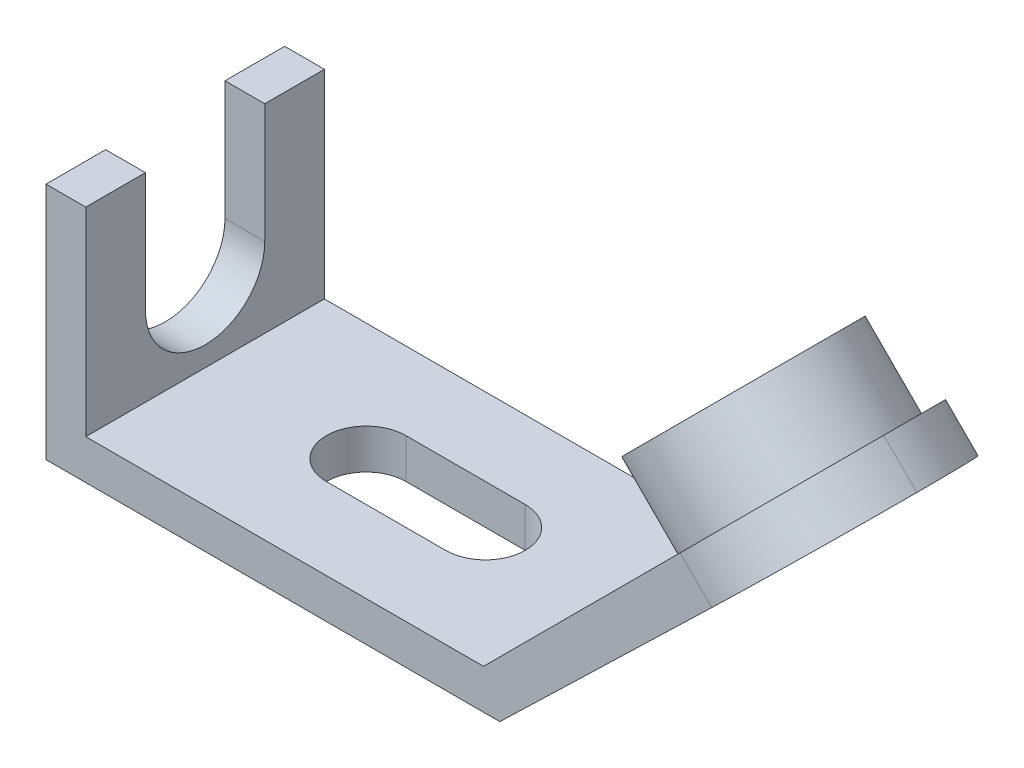
ISO-10303-21;
HEADER;
FILE_DESCRIPTION(('STEP AP214'),'2;1');
FILE_NAME('part.step','',(''),(''),'','','');
FILE_SCHEMA(('AUTOMOTIVE_DESIGN { 1 0 10303 214 1 1 1 1 }'));
ENDSEC;
DATA;
#1=APPLICATION_CONTEXT('core data for automotive mechanical design processes');
#2=APPLICATION_PROTOCOL_DEFINITION('international standard','automotive_design',2000,#1);
#3=PRODUCT_CONTEXT('',#1,'mechanical');
#4=PRODUCT('Part','Part','',(#3));
#5=PRODUCT_RELATED_PRODUCT_CATEGORY('part','',(#4));
#6=PRODUCT_DEFINITION_FORMATION('','',#4);
#7=PRODUCT_DEFINITION_CONTEXT('part definition',#1,'design');
#8=PRODUCT_DEFINITION('design','',#6,#7);
#9=PRODUCT_DEFINITION_SHAPE('','',#8);
#10=(LENGTH_UNIT() NAMED_UNIT(*) SI_UNIT(.MILLI.,.METRE.));
#11=(NAMED_UNIT(*) PLANE_ANGLE_UNIT() SI_UNIT($,.RADIAN.));
#12=(NAMED_UNIT(*) SI_UNIT($,.STERADIAN.) SOLID_ANGLE_UNIT());
#13=UNCERTAINTY_MEASURE_WITH_UNIT(LENGTH_MEASURE(1.E-05),#10,'distance_accuracy_value','');
#14=(GEOMETRIC_REPRESENTATION_CONTEXT(3) GLOBAL_UNCERTAINTY_ASSIGNED_CONTEXT((#13)) GLOBAL_UNIT_ASSIGNED_CONTEXT((#10,
#11,#12)) REPRESENTATION_CONTEXT('',''));
#15=CARTESIAN_POINT('',(0.,0.,0.));
#16=DIRECTION('',(0.,0.,1.));
#17=DIRECTION('',(1.,0.,0.));
#18=AXIS2_PLACEMENT_3D('',#15,#16,#17);
#19=CARTESIAN_POINT('',(0.,60.,60.));
#20=DIRECTION('',(0.,-1.,0.));
#21=DIRECTION('',(0.,0.,-1.));
#22=AXIS2_PLACEMENT_3D('',#19,#20,#21);
#23=PLANE('',#22);
#24=DIRECTION('',(0.,0.,-1.));
#25=VECTOR('',#24,1.);
#26=CARTESIAN_POINT('',(0.,60.,60.));
#27=LINE('',#26,#25);
#28=CARTESIAN_POINT('',(0.,60.,15.));
#29=VERTEX_POINT('',#28);
#30=CARTESIAN_POINT('',(0.,60.,0.));
#31=VERTEX_POINT('',#30);
#32=EDGE_CURVE('E304',#29,#31,#27,.T.);
#33=ORIENTED_EDGE('',*,*,#32,.F.);
#34=DIRECTION('',(1.,0.,0.));
#35=VECTOR('',#34,1.);
#36=CARTESIAN_POINT('',(0.,60.,15.));
#37=LINE('',#36,#35);
#38=CARTESIAN_POINT('',(10.,60.,15.));
#39=VERTEX_POINT('',#38);
#40=EDGE_CURVE('E171',#29,#39,#37,.T.);
#41=ORIENTED_EDGE('',*,*,#40,.T.);
#42=DIRECTION('',(0.,0.,-1.));
#43=VECTOR('',#42,1.);
#44=CARTESIAN_POINT('',(10.,60.,60.));
#45=LINE('',#44,#43);
#46=CARTESIAN_POINT('',(10.,60.,0.));
#47=VERTEX_POINT('',#46);
#48=EDGE_CURVE('E308',#39,#47,#45,.T.);
#49=ORIENTED_EDGE('',*,*,#48,.T.);
#50=DIRECTION('',(-1.,0.,0.));
#51=VECTOR('',#50,1.);
#52=CARTESIAN_POINT('',(0.,60.,0.));
#53=LINE('',#52,#51);
#54=EDGE_CURVE('E295',#47,#31,#53,.T.);
#55=ORIENTED_EDGE('',*,*,#54,.T.);
#56=EDGE_LOOP('',(#33,#41,#49,#55));
#57=FACE_BOUND('',#56,.T.);
#58=ADVANCED_FACE('F38',(#57),#23,.F.);
#59=CARTESIAN_POINT('',(114.1,0.,60.));
#60=DIRECTION('',(0.,1.,0.));
#61=DIRECTION('',(0.,0.,1.));
#62=AXIS2_PLACEMENT_3D('',#59,#60,#61);
#63=PLANE('',#62);
#64=DIRECTION('',(-1.,0.,0.));
#65=VECTOR('',#64,1.);
#66=CARTESIAN_POINT('',(114.1,0.,19.5145805659539));
#67=LINE('',#66,#65);
#68=CARTESIAN_POINT('',(80.,0.,19.5145805659539));
#69=VERTEX_POINT('',#68);
#70=CARTESIAN_POINT('',(50.,0.,19.5145805659539));
#71=VERTEX_POINT('',#70);
#72=EDGE_CURVE('E235',#69,#71,#67,.T.);
#73=ORIENTED_EDGE('',*,*,#72,.T.);
#74=CARTESIAN_POINT('',(50.,0.,29.5145805659539));
#75=DIRECTION('',(0.,1.,0.));
#76=DIRECTION('',(0.,0.,1.));
#77=AXIS2_PLACEMENT_3D('',#74,#75,#76);
#78=CIRCLE('',#77,10.);
#79=CARTESIAN_POINT('',(50.,0.,39.5145805659539));
#80=VERTEX_POINT('',#79);
#81=EDGE_CURVE('E239',#71,#80,#78,.T.);
#82=ORIENTED_EDGE('',*,*,#81,.T.);
#83=DIRECTION('',(1.,0.,0.));
#84=VECTOR('',#83,1.);
#85=CARTESIAN_POINT('',(114.1,0.,39.5145805659539));
#86=LINE('',#85,#84);
#87=CARTESIAN_POINT('',(80.,0.,39.5145805659539));
#88=VERTEX_POINT('',#87);
#89=EDGE_CURVE('E219',#80,#88,#86,.T.);
#90=ORIENTED_EDGE('',*,*,#89,.T.);
#91=CARTESIAN_POINT('',(80.,0.,29.5145805659539));
#92=DIRECTION('',(0.,1.,0.));
#93=DIRECTION('',(0.,0.,1.));
#94=AXIS2_PLACEMENT_3D('',#91,#92,#93);
#95=CIRCLE('',#94,10.);
#96=EDGE_CURVE('E231',#88,#69,#95,.T.);
#97=ORIENTED_EDGE('',*,*,#96,.T.);
#98=EDGE_LOOP('',(#73,#82,#90,#97));
#99=FACE_BOUND('',#98,.T.);
#100=DIRECTION('',(1.,0.,0.));
#101=VECTOR('',#100,1.);
#102=CARTESIAN_POINT('',(114.1,0.,0.));
#103=LINE('',#102,#101);
#104=CARTESIAN_POINT('',(0.,0.,0.));
#105=VERTEX_POINT('',#104);
#106=CARTESIAN_POINT('',(114.1,0.,0.));
#107=VERTEX_POINT('',#106);
#108=EDGE_CURVE('E252',#105,#107,#103,.T.);
#109=ORIENTED_EDGE('',*,*,#108,.T.);
#110=DIRECTION('',(0.,0.,-1.));
#111=VECTOR('',#110,1.);
#112=CARTESIAN_POINT('',(114.1,0.,60.));
#113=LINE('',#112,#111);
#114=CARTESIAN_POINT('',(114.1,0.,60.));
#115=VERTEX_POINT('',#114);
#116=EDGE_CURVE('E321',#115,#107,#113,.T.);
#117=ORIENTED_EDGE('',*,*,#116,.F.);
#118=DIRECTION('',(1.,0.,0.));
#119=VECTOR('',#118,1.);
#120=CARTESIAN_POINT('',(114.1,0.,60.));
#121=LINE('',#120,#119);
#122=CARTESIAN_POINT('',(0.,0.,60.));
#123=VERTEX_POINT('',#122);
#124=EDGE_CURVE('E253',#123,#115,#121,.T.);
#125=ORIENTED_EDGE('',*,*,#124,.F.);
#126=DIRECTION('',(0.,0.,-1.));
#127=VECTOR('',#126,1.);
#128=CARTESIAN_POINT('',(0.,0.,60.));
#129=LINE('',#128,#127);
#130=EDGE_CURVE('E277',#123,#105,#129,.T.);
#131=ORIENTED_EDGE('',*,*,#130,.T.);
#132=EDGE_LOOP('',(#109,#117,#125,#131));
#133=FACE_BOUND('',#132,.T.);
#134=ADVANCED_FACE('F388',(#99,#133),#63,.F.);
#135=CARTESIAN_POINT('',(188.962882851594,72.3350452488178,60.));
#136=DIRECTION('',(-0.694861145521785,0.719143927488895,0.));
#137=DIRECTION('',(-0.719143927488895,-0.694861145521785,0.));
#138=AXIS2_PLACEMENT_3D('',#135,#136,#137);
#139=PLANE('',#138);
#140=CARTESIAN_POINT('',(167.448157867838,51.5467914982784,30.));
#141=DIRECTION('',(-0.694861145521785,0.719143927488895,0.));
#142=DIRECTION('',(-0.719143927488895,-0.694861145521785,0.));
#143=AXIS2_PLACEMENT_3D('',#140,#141,#142);
#144=ELLIPSE('',#143,15.0022116896862,15.);
#145=CARTESIAN_POINT('',(156.659408432298,41.1223374982228,30.));
#146=VERTEX_POINT('',#145);
#147=EDGE_CURVE('E42',#146,#146,#144,.T.);
#148=ORIENTED_EDGE('',*,*,#147,.T.);
#149=EDGE_LOOP('',(#148));
#150=FACE_BOUND('',#149,.T.);
#151=CARTESIAN_POINT('',(167.385383980512,51.4861372487065,30.));
#152=DIRECTION('',(-0.694861145521785,0.719143927488895,0.));
#153=DIRECTION('',(0.719143927488895,0.694861145521785,0.));
#154=AXIS2_PLACEMENT_3D('',#151,#152,#153);
#155=ELLIPSE('',#154,30.0044233793724,30.);
#156=CARTESIAN_POINT('',(167.385383980512,51.4861372487065,0.));
#157=VERTEX_POINT('',#156);
#158=CARTESIAN_POINT('',(188.962882851594,72.3350452488178,30.));
#159=VERTEX_POINT('',#158);
#160=EDGE_CURVE('E339',#157,#159,#155,.F.);
#161=ORIENTED_EDGE('',*,*,#160,.T.);
#162=CARTESIAN_POINT('',(167.385383980512,51.4861372487065,30.));
#163=DIRECTION('',(-0.694861145521785,0.719143927488895,0.));
#164=DIRECTION('',(-0.719143927488895,-0.694861145521785,0.));
#165=AXIS2_PLACEMENT_3D('',#162,#163,#164);
#166=ELLIPSE('',#165,30.0044233793724,30.);
#167=CARTESIAN_POINT('',(167.385383980512,51.4861372487065,60.));
#168=VERTEX_POINT('',#167);
#169=EDGE_CURVE('E342',#159,#168,#166,.F.);
#170=ORIENTED_EDGE('',*,*,#169,.T.);
#171=DIRECTION('',(0.719143927488895,0.694861145521785,0.));
#172=VECTOR('',#171,1.);
#173=CARTESIAN_POINT('',(188.962882851594,72.3350452488178,60.));
#174=LINE('',#173,#172);
#175=EDGE_CURVE('E257',#115,#168,#174,.T.);
#176=ORIENTED_EDGE('',*,*,#175,.F.);
#177=ORIENTED_EDGE('',*,*,#116,.T.);
#178=DIRECTION('',(0.719143927488895,0.694861145521785,0.));
#179=VECTOR('',#178,1.);
#180=CARTESIAN_POINT('',(188.962882851594,72.3350452488178,0.));
#181=LINE('',#180,#179);
#182=EDGE_CURVE('E281',#107,#157,#181,.T.);
#183=ORIENTED_EDGE('',*,*,#182,.T.);
#184=EDGE_LOOP('',(#161,#170,#176,#177,#183));
#185=FACE_BOUND('',#184,.T.);
#186=ADVANCED_FACE('F384',(#150,#185),#139,.F.);
#187=CARTESIAN_POINT('',(110.,9.99999999999999,60.));
#188=DIRECTION('',(0.707106781186548,-0.707106781186547,0.));
#189=DIRECTION('',(0.707106781186547,0.707106781186548,0.));
#190=AXIS2_PLACEMENT_3D('',#187,#188,#189);
#191=PLANE('',#190);
#192=CARTESIAN_POINT('',(159.497474683058,59.4974746830583,30.));
#193=DIRECTION('',(0.707106781186548,-0.707106781186547,0.));
#194=DIRECTION('',(0.707106781186547,0.707106781186548,0.));
#195=AXIS2_PLACEMENT_3D('',#192,#193,#194);
#196=CIRCLE('',#195,25.);
#197=CARTESIAN_POINT('',(177.175144212722,77.175144212722,30.));
#198=VERTEX_POINT('',#197);
#199=EDGE_CURVE('E325',#198,#198,#196,.F.);
#200=ORIENTED_EDGE('',*,*,#199,.F.);
#201=EDGE_LOOP('',(#200));
#202=FACE_BOUND('',#201,.T.);
#203=DIRECTION('',(-0.707106781186547,-0.707106781186548,0.));
#204=VECTOR('',#203,1.);
#205=CARTESIAN_POINT('',(110.,9.99999999999999,60.));
#206=LINE('',#205,#204);
#207=CARTESIAN_POINT('',(159.435760614609,59.4357606146094,60.));
#208=VERTEX_POINT('',#207);
#209=CARTESIAN_POINT('',(110.,9.99999999999999,60.));
#210=VERTEX_POINT('',#209);
#211=EDGE_CURVE('E262',#208,#210,#206,.T.);
#212=ORIENTED_EDGE('',*,*,#211,.F.);
#213=CARTESIAN_POINT('',(159.435760614609,59.4357606146094,30.));
#214=DIRECTION('',(0.707106781186548,-0.707106781186547,0.));
#215=DIRECTION('',(0.707106781186547,0.707106781186548,0.));
#216=AXIS2_PLACEMENT_3D('',#213,#214,#215);
#217=CIRCLE('',#216,30.);
#218=CARTESIAN_POINT('',(180.648964050206,80.6489640502059,30.));
#219=VERTEX_POINT('',#218);
#220=EDGE_CURVE('E336',#208,#219,#217,.F.);
#221=ORIENTED_EDGE('',*,*,#220,.T.);
#222=CARTESIAN_POINT('',(159.435760614609,59.4357606146094,30.));
#223=DIRECTION('',(0.707106781186548,-0.707106781186547,0.));
#224=DIRECTION('',(0.707106781186547,0.707106781186548,0.));
#225=AXIS2_PLACEMENT_3D('',#222,#223,#224);
#226=CIRCLE('',#225,30.);
#227=CARTESIAN_POINT('',(159.435760614609,59.4357606146094,0.));
#228=VERTEX_POINT('',#227);
#229=EDGE_CURVE('E333',#219,#228,#226,.F.);
#230=ORIENTED_EDGE('',*,*,#229,.T.);
#231=DIRECTION('',(-0.707106781186547,-0.707106781186548,0.));
#232=VECTOR('',#231,1.);
#233=CARTESIAN_POINT('',(110.,9.99999999999999,0.));
#234=LINE('',#233,#232);
#235=CARTESIAN_POINT('',(110.,9.99999999999999,0.));
#236=VERTEX_POINT('',#235);
#237=EDGE_CURVE('E285',#228,#236,#234,.T.);
#238=ORIENTED_EDGE('',*,*,#237,.T.);
#239=DIRECTION('',(0.,0.,-1.));
#240=VECTOR('',#239,1.);
#241=CARTESIAN_POINT('',(110.,9.99999999999999,60.));
#242=LINE('',#241,#240);
#243=EDGE_CURVE('E317',#210,#236,#242,.T.);
#244=ORIENTED_EDGE('',*,*,#243,.F.);
#245=EDGE_LOOP('',(#212,#221,#230,#238,#244));
#246=FACE_BOUND('',#245,.T.);
#247=ADVANCED_FACE('F361',(#202,#246),#191,.F.);
#248=CARTESIAN_POINT('',(10.,9.99999999999999,60.));
#249=DIRECTION('',(0.,-1.,0.));
#250=DIRECTION('',(0.,0.,-1.));
#251=AXIS2_PLACEMENT_3D('',#248,#249,#250);
#252=PLANE('',#251);
#253=DIRECTION('',(1.,0.,0.));
#254=VECTOR('',#253,1.);
#255=CARTESIAN_POINT('',(50.,9.99999999999999,39.5145805659539));
#256=LINE('',#255,#254);
#257=CARTESIAN_POINT('',(50.,9.99999999999999,39.5145805659539));
#258=VERTEX_POINT('',#257);
#259=CARTESIAN_POINT('',(80.,9.99999999999999,39.5145805659539));
#260=VERTEX_POINT('',#259);
#261=EDGE_CURVE('E204',#258,#260,#256,.T.);
#262=ORIENTED_EDGE('',*,*,#261,.F.);
#263=CARTESIAN_POINT('',(50.,9.99999999999999,29.5145805659539));
#264=DIRECTION('',(0.,1.,0.));
#265=DIRECTION('',(0.,0.,1.));
#266=AXIS2_PLACEMENT_3D('',#263,#264,#265);
#267=CIRCLE('',#266,10.);
#268=CARTESIAN_POINT('',(50.,9.99999999999999,19.5145805659539));
#269=VERTEX_POINT('',#268);
#270=EDGE_CURVE('E201',#269,#258,#267,.T.);
#271=ORIENTED_EDGE('',*,*,#270,.F.);
#272=DIRECTION('',(-1.,0.,0.));
#273=VECTOR('',#272,1.);
#274=CARTESIAN_POINT('',(50.,9.99999999999999,19.5145805659539));
#275=LINE('',#274,#273);
#276=CARTESIAN_POINT('',(80.,9.99999999999999,19.5145805659539));
#277=VERTEX_POINT('',#276);
#278=EDGE_CURVE('E211',#277,#269,#275,.T.);
#279=ORIENTED_EDGE('',*,*,#278,.F.);
#280=CARTESIAN_POINT('',(80.,9.99999999999999,29.5145805659539));
#281=DIRECTION('',(0.,1.,0.));
#282=DIRECTION('',(0.,0.,1.));
#283=AXIS2_PLACEMENT_3D('',#280,#281,#282);
#284=CIRCLE('',#283,10.);
#285=EDGE_CURVE('E207',#260,#277,#284,.T.);
#286=ORIENTED_EDGE('',*,*,#285,.F.);
#287=EDGE_LOOP('',(#262,#271,#279,#286));
#288=FACE_BOUND('',#287,.T.);
#289=DIRECTION('',(-1.,0.,0.));
#290=VECTOR('',#289,1.);
#291=CARTESIAN_POINT('',(10.,9.99999999999999,0.));
#292=LINE('',#291,#290);
#293=CARTESIAN_POINT('',(10.,9.99999999999999,0.));
#294=VERTEX_POINT('',#293);
#295=EDGE_CURVE('E288',#236,#294,#292,.T.);
#296=ORIENTED_EDGE('',*,*,#295,.T.);
#297=DIRECTION('',(0.,0.,-1.));
#298=VECTOR('',#297,1.);
#299=CARTESIAN_POINT('',(10.,9.99999999999999,60.));
#300=LINE('',#299,#298);
#301=CARTESIAN_POINT('',(10.,9.99999999999999,60.));
#302=VERTEX_POINT('',#301);
#303=EDGE_CURVE('E313',#302,#294,#300,.T.);
#304=ORIENTED_EDGE('',*,*,#303,.F.);
#305=DIRECTION('',(-1.,0.,0.));
#306=VECTOR('',#305,1.);
#307=CARTESIAN_POINT('',(10.,9.99999999999999,60.));
#308=LINE('',#307,#306);
#309=EDGE_CURVE('E265',#210,#302,#308,.T.);
#310=ORIENTED_EDGE('',*,*,#309,.F.);
#311=ORIENTED_EDGE('',*,*,#243,.T.);
#312=EDGE_LOOP('',(#296,#304,#310,#311));
#313=FACE_BOUND('',#312,.T.);
#314=ADVANCED_FACE('F370',(#288,#313),#252,.F.);
#315=CARTESIAN_POINT('',(10.,60.,60.));
#316=DIRECTION('',(-1.,0.,0.));
#317=DIRECTION('',(0.,-1.,0.));
#318=AXIS2_PLACEMENT_3D('',#315,#316,#317);
#319=PLANE('',#318);
#320=ORIENTED_EDGE('',*,*,#48,.F.);
#321=DIRECTION('',(0.,-1.,0.));
#322=VECTOR('',#321,1.);
#323=CARTESIAN_POINT('',(10.,60.,15.));
#324=LINE('',#323,#322);
#325=CARTESIAN_POINT('',(10.,30.,15.));
#326=VERTEX_POINT('',#325);
#327=EDGE_CURVE('E196',#39,#326,#324,.T.);
#328=ORIENTED_EDGE('',*,*,#327,.T.);
#329=CARTESIAN_POINT('',(10.,30.,30.));
#330=DIRECTION('',(-1.,0.,0.));
#331=DIRECTION('',(0.,-1.,0.));
#332=AXIS2_PLACEMENT_3D('',#329,#330,#331);
#333=CIRCLE('',#332,15.);
#334=CARTESIAN_POINT('',(10.,30.,45.));
#335=VERTEX_POINT('',#334);
#336=EDGE_CURVE('E162',#326,#335,#333,.T.);
#337=ORIENTED_EDGE('',*,*,#336,.T.);
#338=DIRECTION('',(0.,1.,0.));
#339=VECTOR('',#338,1.);
#340=CARTESIAN_POINT('',(10.,60.,45.));
#341=LINE('',#340,#339);
#342=CARTESIAN_POINT('',(10.,60.,45.));
#343=VERTEX_POINT('',#342);
#344=EDGE_CURVE('E190',#335,#343,#341,.T.);
#345=ORIENTED_EDGE('',*,*,#344,.T.);
#346=CARTESIAN_POINT('',(10.,60.,60.));
#347=VERTEX_POINT('',#346);
#348=EDGE_CURVE('E309',#347,#343,#45,.T.);
#349=ORIENTED_EDGE('',*,*,#348,.F.);
#350=DIRECTION('',(0.,1.,0.));
#351=VECTOR('',#350,1.);
#352=CARTESIAN_POINT('',(10.,60.,60.));
#353=LINE('',#352,#351);
#354=EDGE_CURVE('E268',#302,#347,#353,.T.);
#355=ORIENTED_EDGE('',*,*,#354,.F.);
#356=ORIENTED_EDGE('',*,*,#303,.T.);
#357=DIRECTION('',(0.,1.,0.));
#358=VECTOR('',#357,1.);
#359=CARTESIAN_POINT('',(10.,60.,0.));
#360=LINE('',#359,#358);
#361=EDGE_CURVE('E291',#294,#47,#360,.T.);
#362=ORIENTED_EDGE('',*,*,#361,.T.);
#363=EDGE_LOOP('',(#320,#328,#337,#345,#349,#355,#356,#362));
#364=FACE_BOUND('',#363,.T.);
#365=ADVANCED_FACE('F375',(#364),#319,.F.);
#366=ORIENTED_EDGE('',*,*,#348,.T.);
#367=DIRECTION('',(-1.,0.,0.));
#368=VECTOR('',#367,1.);
#369=CARTESIAN_POINT('',(0.,60.,45.));
#370=LINE('',#369,#368);
#371=CARTESIAN_POINT('',(0.,60.,45.));
#372=VERTEX_POINT('',#371);
#373=EDGE_CURVE('E166',#343,#372,#370,.T.);
#374=ORIENTED_EDGE('',*,*,#373,.T.);
#375=CARTESIAN_POINT('',(0.,60.,60.));
#376=VERTEX_POINT('',#375);
#377=EDGE_CURVE('E305',#376,#372,#27,.T.);
#378=ORIENTED_EDGE('',*,*,#377,.F.);
#379=DIRECTION('',(-1.,0.,0.));
#380=VECTOR('',#379,1.);
#381=CARTESIAN_POINT('',(0.,60.,60.));
#382=LINE('',#381,#380);
#383=EDGE_CURVE('E271',#347,#376,#382,.T.);
#384=ORIENTED_EDGE('',*,*,#383,.F.);
#385=EDGE_LOOP('',(#366,#374,#378,#384));
#386=FACE_BOUND('',#385,.T.);
#387=ADVANCED_FACE('F396',(#386),#23,.F.);
#388=CARTESIAN_POINT('',(0.,0.,60.));
#389=DIRECTION('',(1.,0.,0.));
#390=DIRECTION('',(0.,0.,-1.));
#391=AXIS2_PLACEMENT_3D('',#388,#389,#390);
#392=PLANE('',#391);
#393=CARTESIAN_POINT('',(0.,30.,30.));
#394=DIRECTION('',(-1.,0.,0.));
#395=DIRECTION('',(0.,0.,1.));
#396=AXIS2_PLACEMENT_3D('',#393,#394,#395);
#397=CIRCLE('',#396,15.);
#398=CARTESIAN_POINT('',(0.,30.,15.));
#399=VERTEX_POINT('',#398);
#400=CARTESIAN_POINT('',(0.,30.,45.));
#401=VERTEX_POINT('',#400);
#402=EDGE_CURVE('E55',#399,#401,#397,.T.);
#403=ORIENTED_EDGE('',*,*,#402,.F.);
#404=DIRECTION('',(0.,1.,0.));
#405=VECTOR('',#404,1.);
#406=CARTESIAN_POINT('',(0.,0.,15.));
#407=LINE('',#406,#405);
#408=EDGE_CURVE('E11',#399,#29,#407,.T.);
#409=ORIENTED_EDGE('',*,*,#408,.T.);
#410=ORIENTED_EDGE('',*,*,#32,.T.);
#411=DIRECTION('',(0.,-1.,0.));
#412=VECTOR('',#411,1.);
#413=CARTESIAN_POINT('',(0.,0.,0.));
#414=LINE('',#413,#412);
#415=EDGE_CURVE('E258',#31,#105,#414,.T.);
#416=ORIENTED_EDGE('',*,*,#415,.T.);
#417=ORIENTED_EDGE('',*,*,#130,.F.);
#418=DIRECTION('',(0.,-1.,0.));
#419=VECTOR('',#418,1.);
#420=CARTESIAN_POINT('',(0.,0.,60.));
#421=LINE('',#420,#419);
#422=EDGE_CURVE('E274',#376,#123,#421,.T.);
#423=ORIENTED_EDGE('',*,*,#422,.F.);
#424=ORIENTED_EDGE('',*,*,#377,.T.);
#425=DIRECTION('',(0.,1.,0.));
#426=VECTOR('',#425,1.);
#427=CARTESIAN_POINT('',(0.,30.,45.));
#428=LINE('',#427,#426);
#429=EDGE_CURVE('E177',#401,#372,#428,.T.);
#430=ORIENTED_EDGE('',*,*,#429,.F.);
#431=EDGE_LOOP('',(#403,#409,#410,#416,#417,#423,#424,#430));
#432=FACE_BOUND('',#431,.T.);
#433=ADVANCED_FACE('F175',(#432),#392,.F.);
#434=CARTESIAN_POINT('',(0.,0.,60.));
#435=DIRECTION('',(0.,0.,-1.));
#436=DIRECTION('',(-1.,0.,0.));
#437=AXIS2_PLACEMENT_3D('',#434,#435,#436);
#438=PLANE('',#437);
#439=ORIENTED_EDGE('',*,*,#175,.T.);
#440=DIRECTION('',(-0.707106781186549,0.707106781186546,0.));
#441=VECTOR('',#440,1.);
#442=CARTESIAN_POINT('',(109.435760614609,109.43576061461,60.));
#443=LINE('',#442,#441);
#444=EDGE_CURVE('E329',#168,#208,#443,.T.);
#445=ORIENTED_EDGE('',*,*,#444,.T.);
#446=ORIENTED_EDGE('',*,*,#211,.T.);
#447=ORIENTED_EDGE('',*,*,#309,.T.);
#448=ORIENTED_EDGE('',*,*,#354,.T.);
#449=ORIENTED_EDGE('',*,*,#383,.T.);
#450=ORIENTED_EDGE('',*,*,#422,.T.);
#451=ORIENTED_EDGE('',*,*,#124,.T.);
#452=EDGE_LOOP('',(#439,#445,#446,#447,#448,#449,#450,#451));
#453=FACE_BOUND('',#452,.T.);
#454=ADVANCED_FACE('F379',(#453),#438,.F.);
#455=CARTESIAN_POINT('',(0.,0.,0.));
#456=DIRECTION('',(0.,0.,-1.));
#457=DIRECTION('',(-1.,0.,0.));
#458=AXIS2_PLACEMENT_3D('',#455,#456,#457);
#459=PLANE('',#458);
#460=ORIENTED_EDGE('',*,*,#237,.F.);
#461=DIRECTION('',(-0.707106781186549,0.707106781186546,0.));
#462=VECTOR('',#461,1.);
#463=CARTESIAN_POINT('',(167.749679415998,51.1218418132214,0.));
#464=LINE('',#463,#462);
#465=EDGE_CURVE('E48',#228,#157,#464,.F.);
#466=ORIENTED_EDGE('',*,*,#465,.T.);
#467=ORIENTED_EDGE('',*,*,#182,.F.);
#468=ORIENTED_EDGE('',*,*,#108,.F.);
#469=ORIENTED_EDGE('',*,*,#415,.F.);
#470=ORIENTED_EDGE('',*,*,#54,.F.);
#471=ORIENTED_EDGE('',*,*,#361,.F.);
#472=ORIENTED_EDGE('',*,*,#295,.F.);
#473=EDGE_LOOP('',(#460,#466,#467,#468,#469,#470,#471,#472));
#474=FACE_BOUND('',#473,.T.);
#475=ADVANCED_FACE('F365',(#474),#459,.T.);
#476=CARTESIAN_POINT('',(145.355339059327,73.6396103067893,30.));
#477=DIRECTION('',(-0.707106781186548,0.707106781186547,0.));
#478=DIRECTION('',(-0.707106781186547,-0.707106781186548,0.));
#479=AXIS2_PLACEMENT_3D('',#476,#477,#478);
#480=PLANE('',#479);
#481=CARTESIAN_POINT('',(145.355339059327,73.6396103067893,30.));
#482=DIRECTION('',(-0.707106781186548,0.707106781186547,0.));
#483=DIRECTION('',(-0.707106781186547,-0.707106781186548,0.));
#484=AXIS2_PLACEMENT_3D('',#481,#482,#483);
#485=CIRCLE('',#484,25.);
#486=CARTESIAN_POINT('',(127.677669529664,55.9619407771256,30.));
#487=VERTEX_POINT('',#486);
#488=EDGE_CURVE('E248',#487,#487,#485,.T.);
#489=ORIENTED_EDGE('',*,*,#488,.T.);
#490=EDGE_LOOP('',(#489));
#491=FACE_BOUND('',#490,.T.);
#492=CARTESIAN_POINT('',(145.355339059327,73.6396103067893,30.));
#493=DIRECTION('',(-0.707106781186548,0.707106781186547,0.));
#494=DIRECTION('',(-0.707106781186547,-0.707106781186548,0.));
#495=AXIS2_PLACEMENT_3D('',#492,#493,#494);
#496=CIRCLE('',#495,15.);
#497=CARTESIAN_POINT('',(134.748737341529,63.0330085889911,30.));
#498=VERTEX_POINT('',#497);
#499=EDGE_CURVE('E244',#498,#498,#496,.T.);
#500=ORIENTED_EDGE('',*,*,#499,.F.);
#501=EDGE_LOOP('',(#500));
#502=FACE_BOUND('',#501,.T.);
#503=ADVANCED_FACE('F449',(#491,#502),#480,.T.);
#504=CARTESIAN_POINT('',(145.355339059327,73.6396103067893,30.));
#505=DIRECTION('',(0.707106781186548,-0.707106781186547,0.));
#506=DIRECTION('',(0.707106781186547,0.707106781186548,0.));
#507=AXIS2_PLACEMENT_3D('',#504,#505,#506);
#508=CYLINDRICAL_SURFACE('',#507,25.);
#509=ORIENTED_EDGE('',*,*,#488,.F.);
#510=EDGE_LOOP('',(#509));
#511=FACE_BOUND('',#510,.T.);
#512=ORIENTED_EDGE('',*,*,#199,.T.);
#513=EDGE_LOOP('',(#512));
#514=FACE_BOUND('',#513,.T.);
#515=ADVANCED_FACE('F443',(#511,#514),#508,.T.);
#516=CARTESIAN_POINT('',(145.355339059327,73.6396103067893,30.));
#517=DIRECTION('',(0.707106781186548,-0.707106781186547,0.));
#518=DIRECTION('',(0.707106781186547,0.707106781186548,0.));
#519=AXIS2_PLACEMENT_3D('',#516,#517,#518);
#520=CYLINDRICAL_SURFACE('',#519,15.);
#521=ORIENTED_EDGE('',*,*,#499,.T.);
#522=EDGE_LOOP('',(#521));
#523=FACE_BOUND('',#522,.T.);
#524=ORIENTED_EDGE('',*,*,#147,.F.);
#525=EDGE_LOOP('',(#524));
#526=FACE_BOUND('',#525,.T.);
#527=ADVANCED_FACE('F439',(#523,#526),#520,.F.);
#528=CARTESIAN_POINT('',(159.435760614609,59.4357606146094,30.));
#529=DIRECTION('',(0.707106781186549,-0.707106781186546,0.));
#530=DIRECTION('',(0.707106781186546,0.707106781186549,0.));
#531=AXIS2_PLACEMENT_3D('',#528,#529,#530);
#532=CYLINDRICAL_SURFACE('',#531,30.);
#533=DIRECTION('',(-0.707106781186549,0.707106781186546,0.));
#534=VECTOR('',#533,1.);
#535=CARTESIAN_POINT('',(180.648964050206,80.6489640502059,30.));
#536=LINE('',#535,#534);
#537=EDGE_CURVE('E243',#159,#219,#536,.T.);
#538=ORIENTED_EDGE('',*,*,#537,.F.);
#539=ORIENTED_EDGE('',*,*,#160,.F.);
#540=ORIENTED_EDGE('',*,*,#465,.F.);
#541=ORIENTED_EDGE('',*,*,#229,.F.);
#542=EDGE_LOOP('',(#538,#539,#540,#541));
#543=FACE_BOUND('',#542,.T.);
#544=ADVANCED_FACE('F40',(#543),#532,.T.);
#545=CARTESIAN_POINT('',(109.435760614609,109.43576061461,30.));
#546=DIRECTION('',(-0.707106781186549,0.707106781186546,0.));
#547=DIRECTION('',(-0.707106781186546,-0.707106781186549,0.));
#548=AXIS2_PLACEMENT_3D('',#545,#546,#547);
#549=CYLINDRICAL_SURFACE('',#548,30.);
#550=ORIENTED_EDGE('',*,*,#169,.F.);
#551=ORIENTED_EDGE('',*,*,#537,.T.);
#552=ORIENTED_EDGE('',*,*,#220,.F.);
#553=ORIENTED_EDGE('',*,*,#444,.F.);
#554=EDGE_LOOP('',(#550,#551,#552,#553));
#555=FACE_BOUND('',#554,.T.);
#556=ADVANCED_FACE('F352',(#555),#549,.T.);
#557=CARTESIAN_POINT('',(50.,-10.,29.5145805659539));
#558=DIRECTION('',(0.,1.,0.));
#559=DIRECTION('',(0.,0.,1.));
#560=AXIS2_PLACEMENT_3D('',#557,#558,#559);
#561=CYLINDRICAL_SURFACE('',#560,10.);
#562=DIRECTION('',(0.,1.,0.));
#563=VECTOR('',#562,1.);
#564=CARTESIAN_POINT('',(50.,-10.,19.5145805659539));
#565=LINE('',#564,#563);
#566=EDGE_CURVE('E216',#71,#269,#565,.T.);
#567=ORIENTED_EDGE('',*,*,#566,.T.);
#568=ORIENTED_EDGE('',*,*,#270,.T.);
#569=DIRECTION('',(0.,1.,0.));
#570=VECTOR('',#569,1.);
#571=CARTESIAN_POINT('',(50.,-10.,39.5145805659539));
#572=LINE('',#571,#570);
#573=EDGE_CURVE('E215',#80,#258,#572,.T.);
#574=ORIENTED_EDGE('',*,*,#573,.F.);
#575=ORIENTED_EDGE('',*,*,#81,.F.);
#576=EDGE_LOOP('',(#567,#568,#574,#575));
#577=FACE_BOUND('',#576,.T.);
#578=ADVANCED_FACE('F431',(#577),#561,.F.);
#579=CARTESIAN_POINT('',(50.,-10.,19.5145805659539));
#580=DIRECTION('',(0.,0.,-1.));
#581=DIRECTION('',(-1.,0.,0.));
#582=AXIS2_PLACEMENT_3D('',#579,#580,#581);
#583=PLANE('',#582);
#584=DIRECTION('',(0.,1.,0.));
#585=VECTOR('',#584,1.);
#586=CARTESIAN_POINT('',(80.,-10.,19.5145805659539));
#587=LINE('',#586,#585);
#588=EDGE_CURVE('E220',#69,#277,#587,.T.);
#589=ORIENTED_EDGE('',*,*,#588,.T.);
#590=ORIENTED_EDGE('',*,*,#278,.T.);
#591=ORIENTED_EDGE('',*,*,#566,.F.);
#592=ORIENTED_EDGE('',*,*,#72,.F.);
#593=EDGE_LOOP('',(#589,#590,#591,#592));
#594=FACE_BOUND('',#593,.T.);
#595=ADVANCED_FACE('F436',(#594),#583,.F.);
#596=CARTESIAN_POINT('',(80.,-10.,29.5145805659539));
#597=DIRECTION('',(0.,1.,0.));
#598=DIRECTION('',(0.,0.,1.));
#599=AXIS2_PLACEMENT_3D('',#596,#597,#598);
#600=CYLINDRICAL_SURFACE('',#599,10.);
#601=DIRECTION('',(0.,1.,0.));
#602=VECTOR('',#601,1.);
#603=CARTESIAN_POINT('',(80.,-10.,39.5145805659539));
#604=LINE('',#603,#602);
#605=EDGE_CURVE('E63',#88,#260,#604,.T.);
#606=ORIENTED_EDGE('',*,*,#605,.T.);
#607=ORIENTED_EDGE('',*,*,#285,.T.);
#608=ORIENTED_EDGE('',*,*,#588,.F.);
#609=ORIENTED_EDGE('',*,*,#96,.F.);
#610=EDGE_LOOP('',(#606,#607,#608,#609));
#611=FACE_BOUND('',#610,.T.);
#612=ADVANCED_FACE('F528',(#611),#600,.F.);
#613=CARTESIAN_POINT('',(50.,-10.,39.5145805659539));
#614=DIRECTION('',(0.,0.,1.));
#615=DIRECTION('',(1.,0.,0.));
#616=AXIS2_PLACEMENT_3D('',#613,#614,#615);
#617=PLANE('',#616);
#618=ORIENTED_EDGE('',*,*,#573,.T.);
#619=ORIENTED_EDGE('',*,*,#261,.T.);
#620=ORIENTED_EDGE('',*,*,#605,.F.);
#621=ORIENTED_EDGE('',*,*,#89,.F.);
#622=EDGE_LOOP('',(#618,#619,#620,#621));
#623=FACE_BOUND('',#622,.T.);
#624=ADVANCED_FACE('F538',(#623),#617,.F.);
#625=CARTESIAN_POINT('',(20.,30.,30.));
#626=DIRECTION('',(-1.,0.,0.));
#627=DIRECTION('',(0.,0.,1.));
#628=AXIS2_PLACEMENT_3D('',#625,#626,#627);
#629=CYLINDRICAL_SURFACE('',#628,15.);
#630=DIRECTION('',(-1.,0.,0.));
#631=VECTOR('',#630,1.);
#632=CARTESIAN_POINT('',(20.,30.,15.));
#633=LINE('',#632,#631);
#634=EDGE_CURVE('E158',#326,#399,#633,.T.);
#635=ORIENTED_EDGE('',*,*,#634,.T.);
#636=ORIENTED_EDGE('',*,*,#402,.T.);
#637=DIRECTION('',(-1.,0.,0.));
#638=VECTOR('',#637,1.);
#639=CARTESIAN_POINT('',(20.,30.,45.));
#640=LINE('',#639,#638);
#641=EDGE_CURVE('E167',#335,#401,#640,.T.);
#642=ORIENTED_EDGE('',*,*,#641,.F.);
#643=ORIENTED_EDGE('',*,*,#336,.F.);
#644=EDGE_LOOP('',(#635,#636,#642,#643));
#645=FACE_BOUND('',#644,.T.);
#646=ADVANCED_FACE('F160',(#645),#629,.F.);
#647=CARTESIAN_POINT('',(20.,30.,15.));
#648=DIRECTION('',(0.,0.,-1.));
#649=DIRECTION('',(-1.,0.,0.));
#650=AXIS2_PLACEMENT_3D('',#647,#648,#649);
#651=PLANE('',#650);
#652=ORIENTED_EDGE('',*,*,#40,.F.);
#653=ORIENTED_EDGE('',*,*,#408,.F.);
#654=ORIENTED_EDGE('',*,*,#634,.F.);
#655=ORIENTED_EDGE('',*,*,#327,.F.);
#656=EDGE_LOOP('',(#652,#653,#654,#655));
#657=FACE_BOUND('',#656,.T.);
#658=ADVANCED_FACE('F169',(#657),#651,.F.);
#659=CARTESIAN_POINT('',(20.,30.,45.));
#660=DIRECTION('',(0.,0.,1.));
#661=DIRECTION('',(1.,0.,0.));
#662=AXIS2_PLACEMENT_3D('',#659,#660,#661);
#663=PLANE('',#662);
#664=ORIENTED_EDGE('',*,*,#641,.T.);
#665=ORIENTED_EDGE('',*,*,#429,.T.);
#666=ORIENTED_EDGE('',*,*,#373,.F.);
#667=ORIENTED_EDGE('',*,*,#344,.F.);
#668=EDGE_LOOP('',(#664,#665,#666,#667));
#669=FACE_BOUND('',#668,.T.);
#670=ADVANCED_FACE('F397',(#669),#663,.F.);
#671=CLOSED_SHELL('',(#58,#134,#186,#247,#314,#365,#387,#433,#454,#475,#503,#515,#527,#544,#556,
#578,#595,#612,#624,#646,#658,#670));
#672=MANIFOLD_SOLID_BREP('B2',#671);
#673=ADVANCED_BREP_SHAPE_REPRESENTATION('',(#18,#672),#14);
#674=SHAPE_DEFINITION_REPRESENTATION(#9,#673);
ENDSEC;
END-ISO-10303-21;
